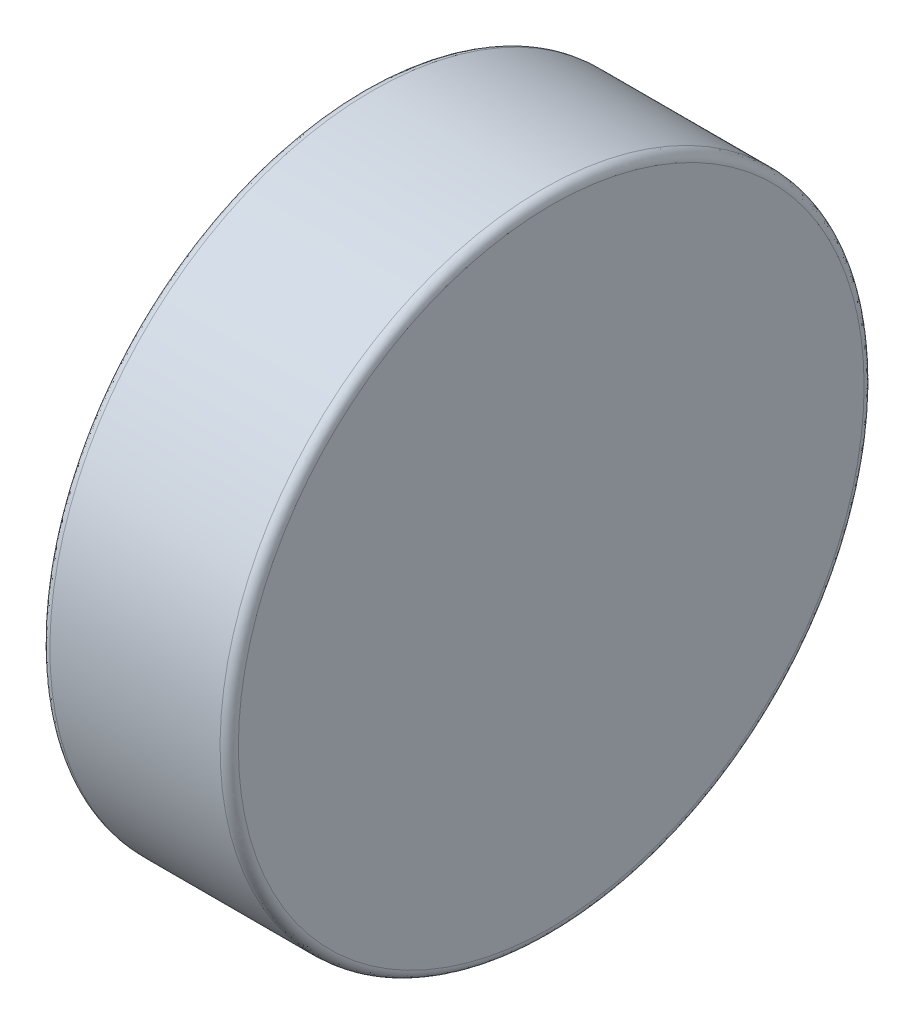
ISO-10303-21;
HEADER;
FILE_DESCRIPTION(('STEP AP214'),'2;1');
FILE_NAME('part.step','',(''),(''),'','','');
FILE_SCHEMA(('AUTOMOTIVE_DESIGN { 1 0 10303 214 1 1 1 1 }'));
ENDSEC;
DATA;
#1=APPLICATION_CONTEXT('core data for automotive mechanical design processes');
#2=APPLICATION_PROTOCOL_DEFINITION('international standard','automotive_design',2000,#1);
#3=PRODUCT_CONTEXT('',#1,'mechanical');
#4=PRODUCT('Part','Part','',(#3));
#5=PRODUCT_RELATED_PRODUCT_CATEGORY('part','',(#4));
#6=PRODUCT_DEFINITION_FORMATION('','',#4);
#7=PRODUCT_DEFINITION_CONTEXT('part definition',#1,'design');
#8=PRODUCT_DEFINITION('design','',#6,#7);
#9=PRODUCT_DEFINITION_SHAPE('','',#8);
#10=(LENGTH_UNIT() NAMED_UNIT(*) SI_UNIT(.MILLI.,.METRE.));
#11=(NAMED_UNIT(*) PLANE_ANGLE_UNIT() SI_UNIT($,.RADIAN.));
#12=(NAMED_UNIT(*) SI_UNIT($,.STERADIAN.) SOLID_ANGLE_UNIT());
#13=UNCERTAINTY_MEASURE_WITH_UNIT(LENGTH_MEASURE(1.E-05),#10,'distance_accuracy_value','');
#14=(GEOMETRIC_REPRESENTATION_CONTEXT(3) GLOBAL_UNCERTAINTY_ASSIGNED_CONTEXT((#13)) GLOBAL_UNIT_ASSIGNED_CONTEXT((#10,
#11,#12)) REPRESENTATION_CONTEXT('',''));
#15=CARTESIAN_POINT('',(0.,0.,0.));
#16=DIRECTION('',(0.,0.,1.));
#17=DIRECTION('',(1.,0.,0.));
#18=AXIS2_PLACEMENT_3D('',#15,#16,#17);
#19=CARTESIAN_POINT('',(-9.3,35.2,0.));
#20=CARTESIAN_POINT('',(-9.49638093719936,35.2001155991308,0.));
#21=CARTESIAN_POINT('',(-9.69278762576156,35.1561305853357,0.));
#22=CARTESIAN_POINT('',(-9.87766612058697,35.0680379046243,0.));
#23=CARTESIAN_POINT('',(-10.0394622429583,34.93946100449,0.));
#24=CARTESIAN_POINT('',(-10.1680369359182,34.77766681122,0.));
#25=CARTESIAN_POINT('',(-10.2561297728126,34.5927880161686,0.));
#26=CARTESIAN_POINT('',(-10.3001149514555,34.3963810216343,0.));
#27=CARTESIAN_POINT('',(-10.2999993079874,34.2,0.));
#28=B_SPLINE_CURVE_WITH_KNOTS('',8,(#19,#20,#21,#22,#23,#24,#25,#26,#27),.UNSPECIFIED.,.F.,.F.,
(9,9),(-1.57197338757605,-2.19948605995057E-08),.UNSPECIFIED.);
#29=CARTESIAN_POINT('',(-10.2999993079874,0.,0.));
#30=DIRECTION('',(1.,0.,0.));
#31=AXIS1_PLACEMENT('',#29,#30);
#32=SURFACE_OF_REVOLUTION('',#28,#31);
#33=CARTESIAN_POINT('',(-10.2999993079874,0.,0.));
#34=DIRECTION('',(1.,0.,0.));
#35=DIRECTION('',(0.,1.,0.));
#36=AXIS2_PLACEMENT_3D('',#33,#34,#35);
#37=CIRCLE('',#36,34.2);
#38=CARTESIAN_POINT('',(-10.2999993079874,34.2,0.));
#39=VERTEX_POINT('',#38);
#40=EDGE_CURVE('E10',#39,#39,#37,.T.);
#41=ORIENTED_EDGE('',*,*,#40,.T.);
#42=EDGE_LOOP('',(#41));
#43=FACE_BOUND('',#42,.T.);
#44=CARTESIAN_POINT('',(-9.3,0.,0.));
#45=DIRECTION('',(1.,0.,0.));
#46=DIRECTION('',(0.,1.,0.));
#47=AXIS2_PLACEMENT_3D('',#44,#45,#46);
#48=CIRCLE('',#47,35.2);
#49=CARTESIAN_POINT('',(-9.3,35.2,0.));
#50=VERTEX_POINT('',#49);
#51=EDGE_CURVE('E43',#50,#50,#48,.T.);
#52=ORIENTED_EDGE('',*,*,#51,.F.);
#53=EDGE_LOOP('',(#52));
#54=FACE_BOUND('',#53,.T.);
#55=ADVANCED_FACE('F28',(#43,#54),#32,.F.);
#56=CARTESIAN_POINT('',(-10.2999993079874,34.2,0.));
#57=DIRECTION('',(-1.,0.,0.));
#58=DIRECTION('',(0.,-1.,0.));
#59=AXIS2_PLACEMENT_3D('',#56,#57,#58);
#60=PLANE('',#59);
#61=ORIENTED_EDGE('',*,*,#40,.F.);
#62=EDGE_LOOP('',(#61));
#63=FACE_BOUND('',#62,.T.);
#64=ADVANCED_FACE('F66',(#63),#60,.T.);
#65=CARTESIAN_POINT('',(10.2999993079874,0.,0.));
#66=DIRECTION('',(1.,0.,0.));
#67=DIRECTION('',(0.,1.,0.));
#68=AXIS2_PLACEMENT_3D('',#65,#66,#67);
#69=PLANE('',#68);
#70=CARTESIAN_POINT('',(10.2999993079874,0.,0.));
#71=DIRECTION('',(1.,0.,0.));
#72=DIRECTION('',(0.,1.,0.));
#73=AXIS2_PLACEMENT_3D('',#70,#71,#72);
#74=CIRCLE('',#73,34.2);
#75=CARTESIAN_POINT('',(10.2999993079874,34.2,0.));
#76=VERTEX_POINT('',#75);
#77=EDGE_CURVE('E35',#76,#76,#74,.T.);
#78=ORIENTED_EDGE('',*,*,#77,.T.);
#79=EDGE_LOOP('',(#78));
#80=FACE_BOUND('',#79,.T.);
#81=ADVANCED_FACE('F63',(#80),#69,.T.);
#82=CARTESIAN_POINT('',(10.2999993079874,34.2,0.));
#83=CARTESIAN_POINT('',(10.3001149514523,34.3963810216346,0.));
#84=CARTESIAN_POINT('',(10.2561297728114,34.5927880161694,0.));
#85=CARTESIAN_POINT('',(10.1680369359197,34.7776668112207,0.));
#86=CARTESIAN_POINT('',(10.0394622429448,34.9394610044878,0.));
#87=CARTESIAN_POINT('',(9.87766612056895,35.0680379046255,0.));
#88=CARTESIAN_POINT('',(9.69278762575142,35.1561305853382,0.));
#89=CARTESIAN_POINT('',(9.49638093719825,35.2001155991313,0.));
#90=CARTESIAN_POINT('',(9.3,35.2,0.));
#91=B_SPLINE_CURVE_WITH_KNOTS('',8,(#82,#83,#84,#85,#86,#87,#88,#89,#90),.UNSPECIFIED.,.F.,.F.,
(9,9),(2.20157004584352E-08,1.57197338758212),.UNSPECIFIED.);
#92=CARTESIAN_POINT('',(-10.2999993079874,0.,0.));
#93=DIRECTION('',(1.,0.,0.));
#94=AXIS1_PLACEMENT('',#92,#93);
#95=SURFACE_OF_REVOLUTION('',#91,#94);
#96=CARTESIAN_POINT('',(9.30000000000001,0.,0.));
#97=DIRECTION('',(1.,0.,0.));
#98=DIRECTION('',(0.,1.,0.));
#99=AXIS2_PLACEMENT_3D('',#96,#97,#98);
#100=CIRCLE('',#99,35.2);
#101=CARTESIAN_POINT('',(9.3,35.2,0.));
#102=VERTEX_POINT('',#101);
#103=EDGE_CURVE('E39',#102,#102,#100,.T.);
#104=ORIENTED_EDGE('',*,*,#103,.T.);
#105=EDGE_LOOP('',(#104));
#106=FACE_BOUND('',#105,.T.);
#107=ORIENTED_EDGE('',*,*,#77,.F.);
#108=EDGE_LOOP('',(#107));
#109=FACE_BOUND('',#108,.T.);
#110=ADVANCED_FACE('F58',(#106,#109),#95,.F.);
#111=CARTESIAN_POINT('',(-10.2999993079874,0.,0.));
#112=DIRECTION('',(1.,0.,0.));
#113=DIRECTION('',(0.,1.,0.));
#114=AXIS2_PLACEMENT_3D('',#111,#112,#113);
#115=CYLINDRICAL_SURFACE('',#114,35.2);
#116=ORIENTED_EDGE('',*,*,#51,.T.);
#117=EDGE_LOOP('',(#116));
#118=FACE_BOUND('',#117,.T.);
#119=ORIENTED_EDGE('',*,*,#103,.F.);
#120=EDGE_LOOP('',(#119));
#121=FACE_BOUND('',#120,.T.);
#122=ADVANCED_FACE('F62',(#118,#121),#115,.T.);
#123=CLOSED_SHELL('',(#55,#64,#81,#110,#122));
#124=MANIFOLD_SOLID_BREP('B2',#123);
#125=ADVANCED_BREP_SHAPE_REPRESENTATION('',(#18,#124),#14);
#126=SHAPE_DEFINITION_REPRESENTATION(#9,#125);
ENDSEC;
END-ISO-10303-21;
